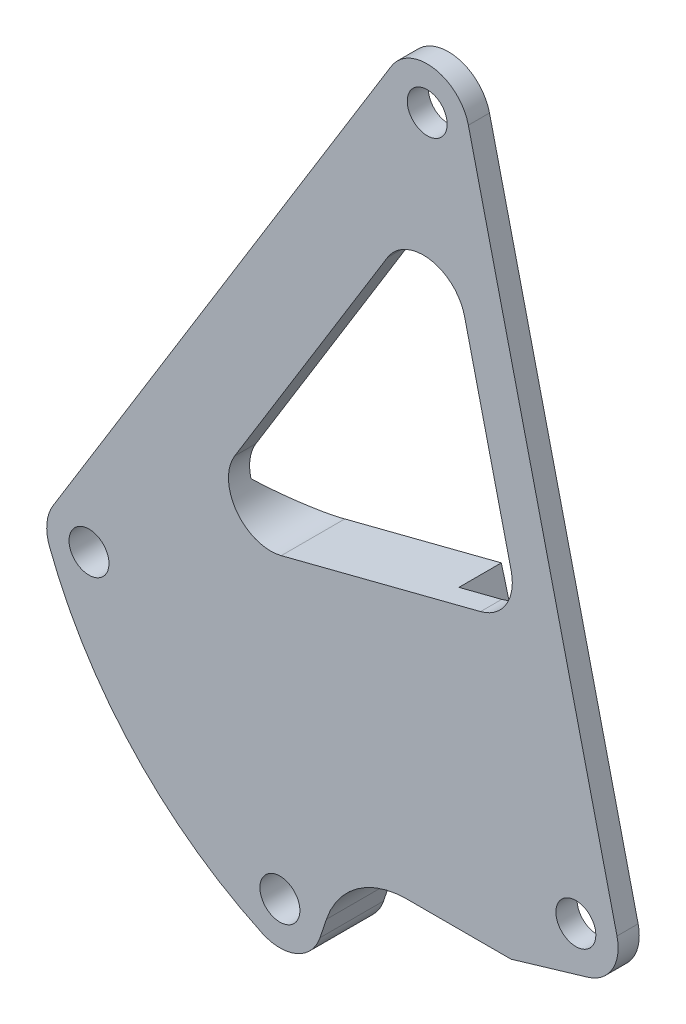
ISO-10303-21;
HEADER;
FILE_DESCRIPTION(('STEP AP214'),'2;1');
FILE_NAME('part.step','',(''),(''),'','','');
FILE_SCHEMA(('AUTOMOTIVE_DESIGN { 1 0 10303 214 1 1 1 1 }'));
ENDSEC;
DATA;
#1=APPLICATION_CONTEXT('core data for automotive mechanical design processes');
#2=APPLICATION_PROTOCOL_DEFINITION('international standard','automotive_design',2000,#1);
#3=PRODUCT_CONTEXT('',#1,'mechanical');
#4=PRODUCT('Part','Part','',(#3));
#5=PRODUCT_RELATED_PRODUCT_CATEGORY('part','',(#4));
#6=PRODUCT_DEFINITION_FORMATION('','',#4);
#7=PRODUCT_DEFINITION_CONTEXT('part definition',#1,'design');
#8=PRODUCT_DEFINITION('design','',#6,#7);
#9=PRODUCT_DEFINITION_SHAPE('','',#8);
#10=(LENGTH_UNIT() NAMED_UNIT(*) SI_UNIT(.MILLI.,.METRE.));
#11=(NAMED_UNIT(*) PLANE_ANGLE_UNIT() SI_UNIT($,.RADIAN.));
#12=(NAMED_UNIT(*) SI_UNIT($,.STERADIAN.) SOLID_ANGLE_UNIT());
#13=UNCERTAINTY_MEASURE_WITH_UNIT(LENGTH_MEASURE(1.E-05),#10,'distance_accuracy_value','');
#14=(GEOMETRIC_REPRESENTATION_CONTEXT(3) GLOBAL_UNCERTAINTY_ASSIGNED_CONTEXT((#13)) GLOBAL_UNIT_ASSIGNED_CONTEXT((#10,
#11,#12)) REPRESENTATION_CONTEXT('',''));
#15=CARTESIAN_POINT('',(0.,0.,0.));
#16=DIRECTION('',(0.,0.,1.));
#17=DIRECTION('',(1.,0.,0.));
#18=AXIS2_PLACEMENT_3D('',#15,#16,#17);
#19=CARTESIAN_POINT('',(44.45,19.05,6.361938));
#20=DIRECTION('',(0.,0.,-1.));
#21=DIRECTION('',(-1.,0.,0.));
#22=AXIS2_PLACEMENT_3D('',#19,#20,#21);
#23=CYLINDRICAL_SURFACE('',#22,6.35);
#24=DIRECTION('',(0.,0.,-1.));
#25=VECTOR('',#24,1.);
#26=CARTESIAN_POINT('',(50.6292365836746,20.5127150245273,6.361938));
#27=LINE('',#26,#25);
#28=CARTESIAN_POINT('',(50.6292365836746,20.5127150245273,6.361938));
#29=VERTEX_POINT('',#28);
#30=CARTESIAN_POINT('',(50.6292365836746,20.5127150245273,3.186938));
#31=VERTEX_POINT('',#30);
#32=EDGE_CURVE('E502',#29,#31,#27,.T.);
#33=ORIENTED_EDGE('',*,*,#32,.F.);
#34=CARTESIAN_POINT('',(44.45,19.05,6.361938));
#35=DIRECTION('',(0.,0.,1.));
#36=DIRECTION('',(1.,0.,0.));
#37=AXIS2_PLACEMENT_3D('',#34,#35,#36);
#38=CIRCLE('',#37,6.35);
#39=CARTESIAN_POINT('',(46.2552706087755,12.9620202013237,6.361938));
#40=VERTEX_POINT('',#39);
#41=EDGE_CURVE('E208',#40,#29,#38,.T.);
#42=ORIENTED_EDGE('',*,*,#41,.F.);
#43=DIRECTION('',(0.,0.,-1.));
#44=VECTOR('',#43,1.);
#45=CARTESIAN_POINT('',(46.2552706087755,12.9620202013237,6.361938));
#46=LINE('',#45,#44);
#47=CARTESIAN_POINT('',(46.2552706087755,12.9620202013237,3.186938));
#48=VERTEX_POINT('',#47);
#49=EDGE_CURVE('E202',#40,#48,#46,.T.);
#50=ORIENTED_EDGE('',*,*,#49,.T.);
#51=CARTESIAN_POINT('',(44.45,19.05,3.186938));
#52=DIRECTION('',(0.,0.,1.));
#53=DIRECTION('',(1.,0.,0.));
#54=AXIS2_PLACEMENT_3D('',#51,#52,#53);
#55=CIRCLE('',#54,6.35);
#56=EDGE_CURVE('E209',#48,#31,#55,.T.);
#57=ORIENTED_EDGE('',*,*,#56,.T.);
#58=EDGE_LOOP('',(#33,#42,#50,#57));
#59=FACE_BOUND('',#58,.T.);
#60=ADVANCED_FACE('F49',(#59),#23,.T.);
#61=CARTESIAN_POINT('',(23.7075407900682,50.8147450314328,-3.186938));
#62=DIRECTION('',(0.966234939592872,0.257662650591734,0.));
#63=DIRECTION('',(-0.257662650591734,0.966234939592873,0.));
#64=AXIS2_PLACEMENT_3D('',#61,#62,#63);
#65=PLANE('',#64);
#66=DIRECTION('',(0.,0.,-1.));
#67=VECTOR('',#66,1.);
#68=CARTESIAN_POINT('',(23.7075407900682,50.8147450314328,3.186938));
#69=LINE('',#68,#67);
#70=CARTESIAN_POINT('',(23.7075407900682,50.8147450314328,3.186938));
#71=VERTEX_POINT('',#70);
#72=CARTESIAN_POINT('',(23.7075407900682,50.8147450314328,-3.186938));
#73=VERTEX_POINT('',#72);
#74=EDGE_CURVE('E274',#71,#73,#69,.T.);
#75=ORIENTED_EDGE('',*,*,#74,.F.);
#76=DIRECTION('',(0.257662650591734,-0.966234939592872,0.));
#77=VECTOR('',#76,1.);
#78=CARTESIAN_POINT('',(31.4406388711029,21.8156272313381,3.186938));
#79=LINE('',#78,#77);
#80=CARTESIAN_POINT('',(34.7142074581717,9.53974503143276,3.186938));
#81=VERTEX_POINT('',#80);
#82=EDGE_CURVE('E513',#71,#81,#79,.T.);
#83=ORIENTED_EDGE('',*,*,#82,.T.);
#84=DIRECTION('',(0.,0.,1.));
#85=VECTOR('',#84,1.);
#86=CARTESIAN_POINT('',(34.7142074581717,9.53974503143276,-3.186938));
#87=LINE('',#86,#85);
#88=CARTESIAN_POINT('',(34.7142074581717,9.53974503143276,-3.186938));
#89=VERTEX_POINT('',#88);
#90=EDGE_CURVE('E217',#89,#81,#87,.T.);
#91=ORIENTED_EDGE('',*,*,#90,.F.);
#92=DIRECTION('',(-0.257662650591734,0.966234939592872,0.));
#93=VECTOR('',#92,1.);
#94=CARTESIAN_POINT('',(23.7075407900682,50.8147450314328,-3.186938));
#95=LINE('',#94,#93);
#96=EDGE_CURVE('E241',#89,#73,#95,.T.);
#97=ORIENTED_EDGE('',*,*,#96,.T.);
#98=EDGE_LOOP('',(#75,#83,#91,#97));
#99=FACE_BOUND('',#98,.T.);
#100=ADVANCED_FACE('F400',(#99),#65,.T.);
#101=CARTESIAN_POINT('',(-28.67279,30.80258,3.186938));
#102=DIRECTION('',(0.,0.,-1.));
#103=DIRECTION('',(-1.,0.,0.));
#104=AXIS2_PLACEMENT_3D('',#101,#102,#103);
#105=CYLINDRICAL_SURFACE('',#104,6.35);
#106=DIRECTION('',(0.,0.,-1.));
#107=VECTOR('',#106,1.);
#108=CARTESIAN_POINT('',(-34.0808203110739,34.1305986529685,6.361938));
#109=LINE('',#108,#107);
#110=CARTESIAN_POINT('',(-34.0808203110739,34.1305986529685,6.361938));
#111=VERTEX_POINT('',#110);
#112=CARTESIAN_POINT('',(-34.0808203110739,34.1305986529685,-3.16306200000008));
#113=VERTEX_POINT('',#112);
#114=EDGE_CURVE('E467',#111,#113,#109,.T.);
#115=ORIENTED_EDGE('',*,*,#114,.T.);
#116=CARTESIAN_POINT('',(-28.67279,30.80258,-3.16306200000008));
#117=DIRECTION('',(0.,0.,1.));
#118=DIRECTION('',(1.,0.,0.));
#119=AXIS2_PLACEMENT_3D('',#116,#117,#118);
#120=CIRCLE('',#119,6.35);
#121=CARTESIAN_POINT('',(-30.2527421807848,36.9528849604417,-3.16306200000008));
#122=VERTEX_POINT('',#121);
#123=EDGE_CURVE('E340',#113,#122,#120,.F.);
#124=ORIENTED_EDGE('',*,*,#123,.T.);
#125=DIRECTION('',(0.,0.,-1.));
#126=VECTOR('',#125,1.);
#127=CARTESIAN_POINT('',(-30.2527421807848,36.9528849604417,3.186938));
#128=LINE('',#127,#126);
#129=CARTESIAN_POINT('',(-30.2527421807848,36.9528849604417,-3.186938));
#130=VERTEX_POINT('',#129);
#131=EDGE_CURVE('E271',#122,#130,#128,.T.);
#132=ORIENTED_EDGE('',*,*,#131,.T.);
#133=CARTESIAN_POINT('',(-28.67279,30.80258,-3.186938));
#134=DIRECTION('',(0.,0.,1.));
#135=DIRECTION('',(1.,0.,0.));
#136=AXIS2_PLACEMENT_3D('',#133,#134,#135);
#137=CIRCLE('',#136,6.35);
#138=CARTESIAN_POINT('',(-34.6046085913835,28.5362993027083,-3.186938));
#139=VERTEX_POINT('',#138);
#140=EDGE_CURVE('E252',#130,#139,#137,.T.);
#141=ORIENTED_EDGE('',*,*,#140,.T.);
#142=DIRECTION('',(0.,0.,-1.));
#143=VECTOR('',#142,1.);
#144=CARTESIAN_POINT('',(-34.6046085913835,28.5362993027083,3.186938));
#145=LINE('',#144,#143);
#146=CARTESIAN_POINT('',(-34.6046085913835,28.5362993027083,6.361938));
#147=VERTEX_POINT('',#146);
#148=EDGE_CURVE('E285',#147,#139,#145,.T.);
#149=ORIENTED_EDGE('',*,*,#148,.F.);
#150=CARTESIAN_POINT('',(-28.67279,30.80258,6.361938));
#151=DIRECTION('',(0.,0.,1.));
#152=DIRECTION('',(1.,0.,0.));
#153=AXIS2_PLACEMENT_3D('',#150,#151,#152);
#154=CIRCLE('',#153,6.35);
#155=EDGE_CURVE('E562',#111,#147,#154,.T.);
#156=ORIENTED_EDGE('',*,*,#155,.F.);
#157=EDGE_LOOP('',(#115,#124,#132,#141,#149,#156));
#158=FACE_BOUND('',#157,.T.);
#159=ADVANCED_FACE('F397',(#158),#105,.T.);
#160=CARTESIAN_POINT('',(-30.2527421807848,36.9528849604417,3.186938));
#161=DIRECTION('',(-0.248811367052726,0.968551962274278,0.));
#162=DIRECTION('',(-0.968551962274278,-0.248811367052726,0.));
#163=AXIS2_PLACEMENT_3D('',#160,#161,#162);
#164=PLANE('',#163);
#165=ORIENTED_EDGE('',*,*,#131,.F.);
#166=DIRECTION('',(0.968551962274278,0.248811367052726,0.));
#167=VECTOR('',#166,1.);
#168=CARTESIAN_POINT('',(-30.2527421807848,36.9528849604417,-3.16306200000008));
#169=LINE('',#168,#167);
#170=CARTESIAN_POINT('',(0.203574933007444,44.776809944993,-3.16306200000008));
#171=VERTEX_POINT('',#170);
#172=EDGE_CURVE('E344',#122,#171,#169,.T.);
#173=ORIENTED_EDGE('',*,*,#172,.T.);
#174=DIRECTION('',(0.,0.,-1.));
#175=VECTOR('',#174,1.);
#176=CARTESIAN_POINT('',(0.203574933007444,44.776809944993,3.186938));
#177=LINE('',#176,#175);
#178=CARTESIAN_POINT('',(0.203574933007445,44.776809944993,6.361938));
#179=VERTEX_POINT('',#178);
#180=EDGE_CURVE('E309',#171,#179,#177,.F.);
#181=ORIENTED_EDGE('',*,*,#180,.T.);
#182=DIRECTION('',(-0.968551962274278,-0.248811367052726,0.));
#183=VECTOR('',#182,1.);
#184=CARTESIAN_POINT('',(-10.7780146245163,41.9557487973768,6.361938));
#185=LINE('',#184,#183);
#186=CARTESIAN_POINT('',(30.1383706068282,52.4667612580421,6.361938));
#187=VERTEX_POINT('',#186);
#188=EDGE_CURVE('E558',#187,#179,#185,.T.);
#189=ORIENTED_EDGE('',*,*,#188,.F.);
#190=DIRECTION('',(0.,0.,1.));
#191=VECTOR('',#190,1.);
#192=CARTESIAN_POINT('',(30.1383706068281,52.4667612580421,3.186938));
#193=LINE('',#192,#191);
#194=CARTESIAN_POINT('',(30.1383706068281,52.4667612580422,3.186938));
#195=VERTEX_POINT('',#194);
#196=EDGE_CURVE('E312',#187,#195,#193,.F.);
#197=ORIENTED_EDGE('',*,*,#196,.T.);
#198=DIRECTION('',(-0.968551962274277,-0.248811367052727,0.));
#199=VECTOR('',#198,1.);
#200=CARTESIAN_POINT('',(23.7075407900682,50.8147450314328,3.186938));
#201=LINE('',#200,#199);
#202=EDGE_CURVE('E479',#195,#71,#201,.T.);
#203=ORIENTED_EDGE('',*,*,#202,.T.);
#204=ORIENTED_EDGE('',*,*,#74,.T.);
#205=DIRECTION('',(0.968551962274278,0.248811367052726,0.));
#206=VECTOR('',#205,1.);
#207=CARTESIAN_POINT('',(-30.2527421807848,36.9528849604417,-3.186938));
#208=LINE('',#207,#206);
#209=EDGE_CURVE('E267',#130,#73,#208,.T.);
#210=ORIENTED_EDGE('',*,*,#209,.F.);
#211=EDGE_LOOP('',(#165,#173,#181,#189,#197,#203,#204,#210));
#212=FACE_BOUND('',#211,.T.);
#213=ADVANCED_FACE('F395',(#212),#164,.T.);
#214=CARTESIAN_POINT('',(0.,0.,-3.186938));
#215=DIRECTION('',(0.,0.,1.));
#216=DIRECTION('',(1.,0.,0.));
#217=AXIS2_PLACEMENT_3D('',#214,#215,#216);
#218=PLANE('',#217);
#219=CARTESIAN_POINT('',(-28.67279,30.80258,-3.186938));
#220=DIRECTION('',(0.,0.,1.));
#221=DIRECTION('',(1.,0.,0.));
#222=AXIS2_PLACEMENT_3D('',#219,#220,#221);
#223=CIRCLE('',#222,3.);
#224=CARTESIAN_POINT('',(-25.67279,30.80258,-3.186938));
#225=VERTEX_POINT('',#224);
#226=EDGE_CURVE('E248',#225,#225,#223,.T.);
#227=ORIENTED_EDGE('',*,*,#226,.T.);
#228=EDGE_LOOP('',(#227));
#229=FACE_BOUND('',#228,.T.);
#230=CARTESIAN_POINT('',(0.,0.,-3.186938));
#231=DIRECTION('',(0.,0.,1.));
#232=DIRECTION('',(1.,0.,0.));
#233=AXIS2_PLACEMENT_3D('',#230,#231,#232);
#234=CIRCLE('',#233,3.);
#235=CARTESIAN_POINT('',(3.,0.,-3.186938));
#236=VERTEX_POINT('',#235);
#237=EDGE_CURVE('E247',#236,#236,#234,.T.);
#238=ORIENTED_EDGE('',*,*,#237,.T.);
#239=EDGE_LOOP('',(#238));
#240=FACE_BOUND('',#239,.T.);
#241=CARTESIAN_POINT('',(23.7075407900682,50.8147450314328,-3.186938));
#242=DIRECTION('',(0.,0.,1.));
#243=DIRECTION('',(1.,0.,0.));
#244=AXIS2_PLACEMENT_3D('',#241,#242,#243);
#245=CIRCLE('',#244,62.423039893716);
#246=CARTESIAN_POINT('',(-2.68476409166118,-5.75452359210793,-3.186938));
#247=VERTEX_POINT('',#246);
#248=EDGE_CURVE('E259',#139,#247,#245,.T.);
#249=ORIENTED_EDGE('',*,*,#248,.F.);
#250=ORIENTED_EDGE('',*,*,#140,.F.);
#251=ORIENTED_EDGE('',*,*,#209,.T.);
#252=ORIENTED_EDGE('',*,*,#96,.F.);
#253=DIRECTION('',(1.,0.,0.));
#254=VECTOR('',#253,1.);
#255=CARTESIAN_POINT('',(23.7075407900682,9.53974503143276,-3.186938));
#256=LINE('',#255,#254);
#257=CARTESIAN_POINT('',(19.0311711474466,9.53974503143276,-3.186938));
#258=VERTEX_POINT('',#257);
#259=EDGE_CURVE('E233',#258,#89,#256,.T.);
#260=ORIENTED_EDGE('',*,*,#259,.F.);
#261=CARTESIAN_POINT('',(19.0311711474466,-3.16025496856724,-3.186938));
#262=DIRECTION('',(0.,0.,1.));
#263=DIRECTION('',(1.,0.,0.));
#264=AXIS2_PLACEMENT_3D('',#261,#262,#263);
#265=CIRCLE('',#264,12.7);
#266=CARTESIAN_POINT('',(6.98808774241796,0.871387637061967,-3.186938));
#267=VERTEX_POINT('',#266);
#268=EDGE_CURVE('E298',#258,#267,#265,.T.);
#269=ORIENTED_EDGE('',*,*,#268,.T.);
#270=DIRECTION('',(0.317452173671591,0.94827428386052,0.));
#271=VECTOR('',#270,1.);
#272=CARTESIAN_POINT('',(6.0215417025143,-2.0158213028146,-3.186938));
#273=LINE('',#272,#271);
#274=CARTESIAN_POINT('',(6.0215417025143,-2.0158213028146,-3.186938));
#275=VERTEX_POINT('',#274);
#276=EDGE_CURVE('E263',#275,#267,#273,.T.);
#277=ORIENTED_EDGE('',*,*,#276,.F.);
#278=CARTESIAN_POINT('',(0.,0.,-3.186938));
#279=DIRECTION('',(0.,0.,1.));
#280=DIRECTION('',(1.,0.,0.));
#281=AXIS2_PLACEMENT_3D('',#278,#279,#280);
#282=CIRCLE('',#281,6.35);
#283=EDGE_CURVE('E289',#247,#275,#282,.T.);
#284=ORIENTED_EDGE('',*,*,#283,.F.);
#285=EDGE_LOOP('',(#249,#250,#251,#252,#260,#269,#277,#284));
#286=FACE_BOUND('',#285,.T.);
#287=ADVANCED_FACE('F391',(#229,#240,#286),#218,.F.);
#288=CARTESIAN_POINT('',(0.,0.,3.186938));
#289=DIRECTION('',(0.,0.,-1.));
#290=DIRECTION('',(-1.,0.,0.));
#291=AXIS2_PLACEMENT_3D('',#288,#289,#290);
#292=CYLINDRICAL_SURFACE('',#291,6.35);
#293=DIRECTION('',(0.,0.,-1.));
#294=VECTOR('',#293,1.);
#295=CARTESIAN_POINT('',(6.0215417025143,-2.0158213028146,3.186938));
#296=LINE('',#295,#294);
#297=CARTESIAN_POINT('',(6.0215417025143,-2.0158213028146,6.361938));
#298=VERTEX_POINT('',#297);
#299=EDGE_CURVE('E277',#298,#275,#296,.T.);
#300=ORIENTED_EDGE('',*,*,#299,.F.);
#301=CARTESIAN_POINT('',(0.,0.,6.361938));
#302=DIRECTION('',(0.,0.,1.));
#303=DIRECTION('',(1.,0.,0.));
#304=AXIS2_PLACEMENT_3D('',#301,#302,#303);
#305=CIRCLE('',#304,6.35);
#306=CARTESIAN_POINT('',(-2.68476409166117,-5.75452359210793,6.361938));
#307=VERTEX_POINT('',#306);
#308=EDGE_CURVE('E569',#307,#298,#305,.T.);
#309=ORIENTED_EDGE('',*,*,#308,.F.);
#310=DIRECTION('',(0.,0.,-1.));
#311=VECTOR('',#310,1.);
#312=CARTESIAN_POINT('',(-2.68476409166118,-5.75452359210793,3.186938));
#313=LINE('',#312,#311);
#314=EDGE_CURVE('E281',#307,#247,#313,.T.);
#315=ORIENTED_EDGE('',*,*,#314,.T.);
#316=ORIENTED_EDGE('',*,*,#283,.T.);
#317=EDGE_LOOP('',(#300,#309,#315,#316));
#318=FACE_BOUND('',#317,.T.);
#319=ADVANCED_FACE('F387',(#318),#292,.T.);
#320=CARTESIAN_POINT('',(23.7075407900682,50.8147450314328,3.186938));
#321=DIRECTION('',(0.,0.,-1.));
#322=DIRECTION('',(-1.,0.,0.));
#323=AXIS2_PLACEMENT_3D('',#320,#321,#322);
#324=CYLINDRICAL_SURFACE('',#323,62.423039893716);
#325=ORIENTED_EDGE('',*,*,#248,.T.);
#326=ORIENTED_EDGE('',*,*,#314,.F.);
#327=CARTESIAN_POINT('',(23.7075407900682,50.8147450314328,6.361938));
#328=DIRECTION('',(0.,0.,1.));
#329=DIRECTION('',(1.,0.,0.));
#330=AXIS2_PLACEMENT_3D('',#327,#328,#329);
#331=CIRCLE('',#330,62.423039893716);
#332=EDGE_CURVE('E565',#147,#307,#331,.T.);
#333=ORIENTED_EDGE('',*,*,#332,.F.);
#334=ORIENTED_EDGE('',*,*,#148,.T.);
#335=EDGE_LOOP('',(#325,#326,#333,#334));
#336=FACE_BOUND('',#335,.T.);
#337=ADVANCED_FACE('F390',(#336),#324,.T.);
#338=CARTESIAN_POINT('',(6.0215417025143,-2.0158213028146,3.186938));
#339=DIRECTION('',(-0.94827428386052,0.317452173671591,0.));
#340=DIRECTION('',(-0.317452173671591,-0.94827428386052,0.));
#341=AXIS2_PLACEMENT_3D('',#338,#339,#340);
#342=PLANE('',#341);
#343=ORIENTED_EDGE('',*,*,#276,.T.);
#344=DIRECTION('',(0.,0.,1.));
#345=VECTOR('',#344,1.);
#346=CARTESIAN_POINT('',(6.98808774241796,0.871387637061967,3.186938));
#347=LINE('',#346,#345);
#348=CARTESIAN_POINT('',(6.98808774241796,0.871387637061964,6.361938));
#349=VERTEX_POINT('',#348);
#350=EDGE_CURVE('E292',#267,#349,#347,.T.);
#351=ORIENTED_EDGE('',*,*,#350,.T.);
#352=DIRECTION('',(0.317452173671591,0.94827428386052,0.));
#353=VECTOR('',#352,1.);
#354=CARTESIAN_POINT('',(6.0215417025143,-2.0158213028146,6.361938));
#355=LINE('',#354,#353);
#356=EDGE_CURVE('E235',#298,#349,#355,.T.);
#357=ORIENTED_EDGE('',*,*,#356,.F.);
#358=ORIENTED_EDGE('',*,*,#299,.T.);
#359=EDGE_LOOP('',(#343,#351,#357,#358));
#360=FACE_BOUND('',#359,.T.);
#361=ADVANCED_FACE('F404',(#360),#342,.F.);
#362=CARTESIAN_POINT('',(0.,0.,-3.186938));
#363=DIRECTION('',(0.,0.,1.));
#364=DIRECTION('',(1.,0.,0.));
#365=AXIS2_PLACEMENT_3D('',#362,#363,#364);
#366=CYLINDRICAL_SURFACE('',#365,3.);
#367=ORIENTED_EDGE('',*,*,#237,.F.);
#368=EDGE_LOOP('',(#367));
#369=FACE_BOUND('',#368,.T.);
#370=CARTESIAN_POINT('',(0.,0.,6.361938));
#371=DIRECTION('',(0.,0.,1.));
#372=DIRECTION('',(1.,0.,0.));
#373=AXIS2_PLACEMENT_3D('',#370,#371,#372);
#374=CIRCLE('',#373,3.);
#375=CARTESIAN_POINT('',(3.,0.,6.361938));
#376=VERTEX_POINT('',#375);
#377=EDGE_CURVE('E554',#376,#376,#374,.F.);
#378=ORIENTED_EDGE('',*,*,#377,.F.);
#379=EDGE_LOOP('',(#378));
#380=FACE_BOUND('',#379,.T.);
#381=ADVANCED_FACE('F408',(#369,#380),#366,.F.);
#382=CARTESIAN_POINT('',(-28.67279,30.80258,-3.186938));
#383=DIRECTION('',(0.,0.,1.));
#384=DIRECTION('',(1.,0.,0.));
#385=AXIS2_PLACEMENT_3D('',#382,#383,#384);
#386=CYLINDRICAL_SURFACE('',#385,3.);
#387=ORIENTED_EDGE('',*,*,#226,.F.);
#388=EDGE_LOOP('',(#387));
#389=FACE_BOUND('',#388,.T.);
#390=CARTESIAN_POINT('',(-28.67279,30.80258,6.361938));
#391=DIRECTION('',(0.,0.,1.));
#392=DIRECTION('',(1.,0.,0.));
#393=AXIS2_PLACEMENT_3D('',#390,#391,#392);
#394=CIRCLE('',#393,3.);
#395=CARTESIAN_POINT('',(-25.67279,30.80258,6.361938));
#396=VERTEX_POINT('',#395);
#397=EDGE_CURVE('E228',#396,#396,#394,.F.);
#398=ORIENTED_EDGE('',*,*,#397,.F.);
#399=EDGE_LOOP('',(#398));
#400=FACE_BOUND('',#399,.T.);
#401=ADVANCED_FACE('F415',(#389,#400),#386,.F.);
#402=CARTESIAN_POINT('',(34.7142074581717,9.53974503143276,-3.186938));
#403=DIRECTION('',(0.,-1.,0.));
#404=DIRECTION('',(1.,0.,0.));
#405=AXIS2_PLACEMENT_3D('',#402,#403,#404);
#406=PLANE('',#405);
#407=ORIENTED_EDGE('',*,*,#90,.T.);
#408=DIRECTION('',(0.,0.,-1.));
#409=VECTOR('',#408,1.);
#410=CARTESIAN_POINT('',(34.7142074581717,9.53974503143276,6.361938));
#411=LINE('',#410,#409);
#412=CARTESIAN_POINT('',(34.7142074581717,9.53974503143276,6.361938));
#413=VERTEX_POINT('',#412);
#414=EDGE_CURVE('E199',#413,#81,#411,.T.);
#415=ORIENTED_EDGE('',*,*,#414,.F.);
#416=DIRECTION('',(1.,0.,0.));
#417=VECTOR('',#416,1.);
#418=CARTESIAN_POINT('',(0.,9.53974503143276,6.361938));
#419=LINE('',#418,#417);
#420=CARTESIAN_POINT('',(19.0311711474466,9.53974503143276,6.361938));
#421=VERTEX_POINT('',#420);
#422=EDGE_CURVE('E215',#421,#413,#419,.T.);
#423=ORIENTED_EDGE('',*,*,#422,.F.);
#424=DIRECTION('',(0.,0.,1.));
#425=VECTOR('',#424,1.);
#426=CARTESIAN_POINT('',(19.0311711474466,9.53974503143276,-3.186938));
#427=LINE('',#426,#425);
#428=EDGE_CURVE('E295',#421,#258,#427,.F.);
#429=ORIENTED_EDGE('',*,*,#428,.T.);
#430=ORIENTED_EDGE('',*,*,#259,.T.);
#431=EDGE_LOOP('',(#407,#415,#423,#429,#430));
#432=FACE_BOUND('',#431,.T.);
#433=ADVANCED_FACE('F214',(#432),#406,.T.);
#434=CARTESIAN_POINT('',(19.0311711474466,-3.16025496856724,3.186938));
#435=DIRECTION('',(0.,0.,1.));
#436=DIRECTION('',(1.,0.,0.));
#437=AXIS2_PLACEMENT_3D('',#434,#435,#436);
#438=CYLINDRICAL_SURFACE('',#437,12.7);
#439=ORIENTED_EDGE('',*,*,#268,.F.);
#440=ORIENTED_EDGE('',*,*,#428,.F.);
#441=CARTESIAN_POINT('',(19.0311711474466,-3.16025496856724,6.361938));
#442=DIRECTION('',(0.,0.,1.));
#443=DIRECTION('',(1.,0.,0.));
#444=AXIS2_PLACEMENT_3D('',#441,#442,#443);
#445=CIRCLE('',#444,12.7);
#446=EDGE_CURVE('E226',#349,#421,#445,.F.);
#447=ORIENTED_EDGE('',*,*,#446,.F.);
#448=ORIENTED_EDGE('',*,*,#350,.F.);
#449=EDGE_LOOP('',(#439,#440,#447,#448));
#450=FACE_BOUND('',#449,.T.);
#451=ADVANCED_FACE('F383',(#450),#438,.F.);
#452=CARTESIAN_POINT('',(0.,0.,6.361938));
#453=DIRECTION('',(0.,0.,1.));
#454=DIRECTION('',(1.,0.,0.));
#455=AXIS2_PLACEMENT_3D('',#452,#453,#454);
#456=PLANE('',#455);
#457=DIRECTION('',(-0.2303488227602,0.973108123413318,0.));
#458=VECTOR('',#457,1.);
#459=CARTESIAN_POINT('',(24.1985104888758,104.60237538596,6.361938));
#460=LINE('',#459,#458);
#461=CARTESIAN_POINT('',(34.7376550097179,60.0797812430111,6.361938));
#462=VERTEX_POINT('',#461);
#463=CARTESIAN_POINT('',(27.736354694195,89.6567598871959,6.361938));
#464=VERTEX_POINT('',#463);
#465=EDGE_CURVE('E490',#462,#464,#460,.T.);
#466=ORIENTED_EDGE('',*,*,#465,.F.);
#467=CARTESIAN_POINT('',(28.5584184260433,58.6170662184838,6.361938));
#468=DIRECTION('',(0.,0.,1.));
#469=DIRECTION('',(1.,0.,0.));
#470=AXIS2_PLACEMENT_3D('',#467,#468,#469);
#471=CIRCLE('',#470,6.35);
#472=EDGE_CURVE('E322',#462,#187,#471,.F.);
#473=ORIENTED_EDGE('',*,*,#472,.T.);
#474=ORIENTED_EDGE('',*,*,#188,.T.);
#475=CARTESIAN_POINT('',(-1.37637724777737,50.9271149054347,6.361938));
#476=DIRECTION('',(0.,0.,1.));
#477=DIRECTION('',(1.,0.,0.));
#478=AXIS2_PLACEMENT_3D('',#475,#476,#477);
#479=CIRCLE('',#478,6.35);
#480=CARTESIAN_POINT('',(-6.78440755885122,54.2551335584032,6.361938));
#481=VERTEX_POINT('',#480);
#482=EDGE_CURVE('E331',#179,#481,#479,.F.);
#483=ORIENTED_EDGE('',*,*,#482,.T.);
#484=DIRECTION('',(0.524097425664335,0.851658316704544,0.));
#485=VECTOR('',#484,1.);
#486=CARTESIAN_POINT('',(27.5352403110739,110.024561347031,6.361938));
#487=LINE('',#486,#485);
#488=CARTESIAN_POINT('',(16.1490877994466,91.5220635156372,6.361938));
#489=VERTEX_POINT('',#488);
#490=EDGE_CURVE('E460',#481,#489,#487,.T.);
#491=ORIENTED_EDGE('',*,*,#490,.T.);
#492=CARTESIAN_POINT('',(21.5571181105204,88.1940448626686,6.361938));
#493=DIRECTION('',(0.,0.,1.));
#494=DIRECTION('',(1.,0.,0.));
#495=AXIS2_PLACEMENT_3D('',#492,#493,#494);
#496=CIRCLE('',#495,6.35);
#497=EDGE_CURVE('E337',#489,#464,#496,.F.);
#498=ORIENTED_EDGE('',*,*,#497,.T.);
#499=EDGE_LOOP('',(#466,#473,#474,#483,#491,#498));
#500=FACE_BOUND('',#499,.T.);
#501=ORIENTED_EDGE('',*,*,#41,.T.);
#502=DIRECTION('',(0.2303488227602,-0.973108123413318,0.));
#503=VECTOR('',#502,1.);
#504=CARTESIAN_POINT('',(50.6292365836746,20.5127150245273,6.361938));
#505=LINE('',#504,#503);
#506=CARTESIAN_POINT('',(28.3064465836746,114.815295024527,6.361938));
#507=VERTEX_POINT('',#506);
#508=EDGE_CURVE('E494',#507,#29,#505,.T.);
#509=ORIENTED_EDGE('',*,*,#508,.F.);
#510=CARTESIAN_POINT('',(22.12721,113.35258,6.361938));
#511=DIRECTION('',(0.,0.,1.));
#512=DIRECTION('',(1.,0.,0.));
#513=AXIS2_PLACEMENT_3D('',#510,#511,#512);
#514=CIRCLE('',#513,6.35);
#515=CARTESIAN_POINT('',(16.7191796889261,116.680598652969,6.361938));
#516=VERTEX_POINT('',#515);
#517=EDGE_CURVE('E536',#507,#516,#514,.T.);
#518=ORIENTED_EDGE('',*,*,#517,.T.);
#519=DIRECTION('',(-0.524097425664335,-0.851658316704544,0.));
#520=VECTOR('',#519,1.);
#521=CARTESIAN_POINT('',(16.7191796889261,116.680598652969,6.361938));
#522=LINE('',#521,#520);
#523=EDGE_CURVE('E468',#516,#111,#522,.T.);
#524=ORIENTED_EDGE('',*,*,#523,.T.);
#525=ORIENTED_EDGE('',*,*,#155,.T.);
#526=ORIENTED_EDGE('',*,*,#332,.T.);
#527=ORIENTED_EDGE('',*,*,#308,.T.);
#528=ORIENTED_EDGE('',*,*,#356,.T.);
#529=ORIENTED_EDGE('',*,*,#446,.T.);
#530=ORIENTED_EDGE('',*,*,#422,.T.);
#531=DIRECTION('',(0.958736976169502,0.284294584059138,0.));
#532=VECTOR('',#531,1.);
#533=CARTESIAN_POINT('',(34.7142074581717,9.53974503143276,6.361938));
#534=LINE('',#533,#532);
#535=EDGE_CURVE('E196',#413,#40,#534,.T.);
#536=ORIENTED_EDGE('',*,*,#535,.T.);
#537=EDGE_LOOP('',(#501,#509,#518,#524,#525,#526,#527,#528,#529,#530,#536));
#538=FACE_BOUND('',#537,.T.);
#539=ORIENTED_EDGE('',*,*,#377,.T.);
#540=EDGE_LOOP('',(#539));
#541=FACE_BOUND('',#540,.T.);
#542=ORIENTED_EDGE('',*,*,#397,.T.);
#543=EDGE_LOOP('',(#542));
#544=FACE_BOUND('',#543,.T.);
#545=CARTESIAN_POINT('',(22.12721,113.35258,6.361938));
#546=DIRECTION('',(0.,0.,1.));
#547=DIRECTION('',(1.,0.,0.));
#548=AXIS2_PLACEMENT_3D('',#545,#546,#547);
#549=CIRCLE('',#548,3.);
#550=CARTESIAN_POINT('',(25.12721,113.35258,6.361938));
#551=VERTEX_POINT('',#550);
#552=EDGE_CURVE('E528',#551,#551,#549,.T.);
#553=ORIENTED_EDGE('',*,*,#552,.F.);
#554=EDGE_LOOP('',(#553));
#555=FACE_BOUND('',#554,.T.);
#556=CARTESIAN_POINT('',(44.45,19.05,6.361938));
#557=DIRECTION('',(0.,0.,1.));
#558=DIRECTION('',(1.,0.,0.));
#559=AXIS2_PLACEMENT_3D('',#556,#557,#558);
#560=CIRCLE('',#559,3.);
#561=CARTESIAN_POINT('',(47.45,19.05,6.361938));
#562=VERTEX_POINT('',#561);
#563=EDGE_CURVE('E509',#562,#562,#560,.T.);
#564=ORIENTED_EDGE('',*,*,#563,.F.);
#565=EDGE_LOOP('',(#564));
#566=FACE_BOUND('',#565,.T.);
#567=ADVANCED_FACE('F222',(#500,#538,#541,#544,#555,#566),#456,.T.);
#568=CARTESIAN_POINT('',(22.12721,113.35258,3.186938));
#569=DIRECTION('',(0.,0.,1.));
#570=DIRECTION('',(1.,0.,0.));
#571=AXIS2_PLACEMENT_3D('',#568,#569,#570);
#572=PLANE('',#571);
#573=CARTESIAN_POINT('',(-1.37637724777737,50.9271149054347,3.186938));
#574=DIRECTION('',(0.,0.,1.));
#575=DIRECTION('',(1.,0.,0.));
#576=AXIS2_PLACEMENT_3D('',#573,#574,#575);
#577=CIRCLE('',#576,6.35);
#578=CARTESIAN_POINT('',(-6.78440755885122,54.2551335584032,3.186938));
#579=VERTEX_POINT('',#578);
#580=CARTESIAN_POINT('',(-7.52668220821904,49.3471627246499,3.186938));
#581=VERTEX_POINT('',#580);
#582=EDGE_CURVE('E328',#579,#581,#577,.T.);
#583=ORIENTED_EDGE('',*,*,#582,.T.);
#584=DIRECTION('',(-0.968551962274278,-0.248811367052726,0.));
#585=VECTOR('',#584,1.);
#586=CARTESIAN_POINT('',(35.7158803475808,60.4557470065996,3.186938));
#587=LINE('',#586,#585);
#588=CARTESIAN_POINT('',(-27.9445663494981,44.1020113405291,3.186938));
#589=VERTEX_POINT('',#588);
#590=EDGE_CURVE('E73',#581,#589,#587,.T.);
#591=ORIENTED_EDGE('',*,*,#590,.T.);
#592=DIRECTION('',(-0.524097425664335,-0.851658316704544,0.));
#593=VECTOR('',#592,1.);
#594=CARTESIAN_POINT('',(16.7191796889261,116.680598652969,3.186938));
#595=LINE('',#594,#593);
#596=CARTESIAN_POINT('',(16.7191796889261,116.680598652969,3.186938));
#597=VERTEX_POINT('',#596);
#598=EDGE_CURVE('E543',#597,#589,#595,.T.);
#599=ORIENTED_EDGE('',*,*,#598,.F.);
#600=CARTESIAN_POINT('',(22.12721,113.35258,3.186938));
#601=DIRECTION('',(0.,0.,1.));
#602=DIRECTION('',(1.,0.,0.));
#603=AXIS2_PLACEMENT_3D('',#600,#601,#602);
#604=CIRCLE('',#603,6.35);
#605=CARTESIAN_POINT('',(28.3064465836746,114.815295024527,3.186938));
#606=VERTEX_POINT('',#605);
#607=EDGE_CURVE('E532',#606,#597,#604,.T.);
#608=ORIENTED_EDGE('',*,*,#607,.F.);
#609=DIRECTION('',(0.2303488227602,-0.973108123413318,0.));
#610=VECTOR('',#609,1.);
#611=CARTESIAN_POINT('',(50.6292365836746,20.5127150245273,3.186938));
#612=LINE('',#611,#610);
#613=EDGE_CURVE('E487',#606,#31,#612,.T.);
#614=ORIENTED_EDGE('',*,*,#613,.T.);
#615=ORIENTED_EDGE('',*,*,#56,.F.);
#616=DIRECTION('',(0.958736976169502,0.284294584059138,0.));
#617=VECTOR('',#616,1.);
#618=CARTESIAN_POINT('',(34.7142074581717,9.53974503143276,3.186938));
#619=LINE('',#618,#617);
#620=EDGE_CURVE('E521',#81,#48,#619,.T.);
#621=ORIENTED_EDGE('',*,*,#620,.F.);
#622=ORIENTED_EDGE('',*,*,#82,.F.);
#623=ORIENTED_EDGE('',*,*,#202,.F.);
#624=CARTESIAN_POINT('',(28.5584184260433,58.6170662184838,3.186938));
#625=DIRECTION('',(0.,0.,1.));
#626=DIRECTION('',(1.,0.,0.));
#627=AXIS2_PLACEMENT_3D('',#624,#625,#626);
#628=CIRCLE('',#627,6.35);
#629=CARTESIAN_POINT('',(34.7376550097179,60.0797812430111,3.186938));
#630=VERTEX_POINT('',#629);
#631=EDGE_CURVE('E325',#195,#630,#628,.T.);
#632=ORIENTED_EDGE('',*,*,#631,.T.);
#633=DIRECTION('',(-0.2303488227602,0.973108123413318,0.));
#634=VECTOR('',#633,1.);
#635=CARTESIAN_POINT('',(24.1985104888758,104.60237538596,3.186938));
#636=LINE('',#635,#634);
#637=CARTESIAN_POINT('',(27.736354694195,89.6567598871959,3.186938));
#638=VERTEX_POINT('',#637);
#639=EDGE_CURVE('E481',#630,#638,#636,.T.);
#640=ORIENTED_EDGE('',*,*,#639,.T.);
#641=CARTESIAN_POINT('',(21.5571181105204,88.1940448626686,3.186938));
#642=DIRECTION('',(0.,0.,1.));
#643=DIRECTION('',(1.,0.,0.));
#644=AXIS2_PLACEMENT_3D('',#641,#642,#643);
#645=CIRCLE('',#644,6.35);
#646=CARTESIAN_POINT('',(16.1490877994466,91.5220635156372,3.186938));
#647=VERTEX_POINT('',#646);
#648=EDGE_CURVE('E334',#638,#647,#645,.T.);
#649=ORIENTED_EDGE('',*,*,#648,.T.);
#650=DIRECTION('',(0.524097425664335,0.851658316704544,0.));
#651=VECTOR('',#650,1.);
#652=CARTESIAN_POINT('',(27.5352403110739,110.024561347031,3.186938));
#653=LINE('',#652,#651);
#654=EDGE_CURVE('E473',#579,#647,#653,.T.);
#655=ORIENTED_EDGE('',*,*,#654,.F.);
#656=EDGE_LOOP('',(#583,#591,#599,#608,#614,#615,#621,#622,#623,#632,#640,#649,#655));
#657=FACE_BOUND('',#656,.T.);
#658=CARTESIAN_POINT('',(22.12721,113.35258,3.186938));
#659=DIRECTION('',(0.,0.,1.));
#660=DIRECTION('',(1.,0.,0.));
#661=AXIS2_PLACEMENT_3D('',#658,#659,#660);
#662=CIRCLE('',#661,3.);
#663=CARTESIAN_POINT('',(25.12721,113.35258,3.186938));
#664=VERTEX_POINT('',#663);
#665=EDGE_CURVE('E219',#664,#664,#662,.T.);
#666=ORIENTED_EDGE('',*,*,#665,.T.);
#667=EDGE_LOOP('',(#666));
#668=FACE_BOUND('',#667,.T.);
#669=CARTESIAN_POINT('',(44.45,19.05,3.186938));
#670=DIRECTION('',(0.,0.,1.));
#671=DIRECTION('',(1.,0.,0.));
#672=AXIS2_PLACEMENT_3D('',#669,#670,#671);
#673=CIRCLE('',#672,3.);
#674=CARTESIAN_POINT('',(47.45,19.05,3.186938));
#675=VERTEX_POINT('',#674);
#676=EDGE_CURVE('E506',#675,#675,#673,.T.);
#677=ORIENTED_EDGE('',*,*,#676,.T.);
#678=EDGE_LOOP('',(#677));
#679=FACE_BOUND('',#678,.T.);
#680=ADVANCED_FACE('F426',(#657,#668,#679),#572,.F.);
#681=CARTESIAN_POINT('',(22.12721,113.35258,6.361938));
#682=DIRECTION('',(0.,0.,-1.));
#683=DIRECTION('',(-1.,0.,0.));
#684=AXIS2_PLACEMENT_3D('',#681,#682,#683);
#685=CYLINDRICAL_SURFACE('',#684,6.35);
#686=ORIENTED_EDGE('',*,*,#517,.F.);
#687=DIRECTION('',(0.,0.,-1.));
#688=VECTOR('',#687,1.);
#689=CARTESIAN_POINT('',(28.3064465836746,114.815295024527,6.361938));
#690=LINE('',#689,#688);
#691=EDGE_CURVE('E497',#507,#606,#690,.T.);
#692=ORIENTED_EDGE('',*,*,#691,.T.);
#693=ORIENTED_EDGE('',*,*,#607,.T.);
#694=DIRECTION('',(0.,0.,-1.));
#695=VECTOR('',#694,1.);
#696=CARTESIAN_POINT('',(16.7191796889261,116.680598652969,6.361938));
#697=LINE('',#696,#695);
#698=EDGE_CURVE('E550',#516,#597,#697,.T.);
#699=ORIENTED_EDGE('',*,*,#698,.F.);
#700=EDGE_LOOP('',(#686,#692,#693,#699));
#701=FACE_BOUND('',#700,.T.);
#702=ADVANCED_FACE('F428',(#701),#685,.T.);
#703=CARTESIAN_POINT('',(16.7191796889261,116.680598652969,6.361938));
#704=DIRECTION('',(0.851658316704544,-0.524097425664335,0.));
#705=DIRECTION('',(0.524097425664335,0.851658316704544,0.));
#706=AXIS2_PLACEMENT_3D('',#703,#704,#705);
#707=PLANE('',#706);
#708=ORIENTED_EDGE('',*,*,#598,.T.);
#709=DIRECTION('',(-0.430471936446104,-0.699516896724919,-0.570412151981951));
#710=VECTOR('',#709,1.);
#711=CARTESIAN_POINT('',(2.96654550243504,94.3325680999205,44.1468063184392));
#712=LINE('',#711,#710);
#713=CARTESIAN_POINT('',(-30.8686384541087,39.3503941705369,-0.68770775626328));
#714=VERTEX_POINT('',#713);
#715=EDGE_CURVE('E11',#589,#714,#712,.T.);
#716=ORIENTED_EDGE('',*,*,#715,.T.);
#717=CARTESIAN_POINT('',(-30.8686384541087,39.3503941705369,-0.68770775626328));
#718=CARTESIAN_POINT('',(-30.9651365200325,39.1935848134107,-0.815525446255014));
#719=CARTESIAN_POINT('',(-31.0623563564455,39.0356025792396,-0.94141428030069));
#720=CARTESIAN_POINT('',(-31.2585542615904,38.7167809833791,-1.18835676580378));
#721=CARTESIAN_POINT('',(-31.3575334120331,38.5559398639098,-1.30940728260518));
#722=CARTESIAN_POINT('',(-31.5588165760478,38.2288547223859,-1.54715328493063));
#723=CARTESIAN_POINT('',(-31.6611475932332,38.0625668194596,-1.66376600277646));
#724=CARTESIAN_POINT('',(-31.8680923076744,37.7262816584926,-1.88932763464581));
#725=CARTESIAN_POINT('',(-31.9727055704353,37.5562851065062,-1.99827799103621));
#726=CARTESIAN_POINT('',(-32.1778613597242,37.2229069489117,-2.20007316855727));
#727=CARTESIAN_POINT('',(-32.2782456454035,37.0597824846829,-2.29350008017284));
#728=CARTESIAN_POINT('',(-32.4815222293517,36.7294580357671,-2.47001546378522));
#729=CARTESIAN_POINT('',(-32.5844149299212,36.5622573973417,-2.55310226421162));
#730=CARTESIAN_POINT('',(-32.7922501629419,36.2245251436829,-2.70614085081657));
#731=CARTESIAN_POINT('',(-32.897178942155,36.0540158774617,-2.77615991426555));
#732=CARTESIAN_POINT('',(-33.109473544381,35.7090371488444,-2.90092040121842));
#733=CARTESIAN_POINT('',(-33.2168379566876,35.5345699788461,-2.95567043590638));
#734=CARTESIAN_POINT('',(-33.4311132787263,35.1863725805333,-3.04618473273483));
#735=CARTESIAN_POINT('',(-33.537975153445,35.0127220341154,-3.08236635214249));
#736=CARTESIAN_POINT('',(-33.7530971263024,34.6631488282222,-3.13558875002146));
#737=CARTESIAN_POINT('',(-33.861357890711,34.4872250860582,-3.15262003996793));
#738=CARTESIAN_POINT('',(-34.025565643455,34.2203874878492,-3.16308296782903));
#739=CARTESIAN_POINT('',(-34.0814062364593,34.1296465242172,-3.16395598797238));
#740=CARTESIAN_POINT('',(-34.1930471281521,33.9482300752165,-3.16034400137222));
#741=CARTESIAN_POINT('',(-34.2488474246888,33.8575545933443,-3.15585872702687));
#742=CARTESIAN_POINT('',(-34.3603096310805,33.6764285079577,-3.14159246471535));
#743=CARTESIAN_POINT('',(-34.4159713706364,33.5859781811794,-3.13180670200525));
#744=CARTESIAN_POINT('',(-34.5269776252929,33.4055930173625,-3.10712084077175));
#745=CARTESIAN_POINT('',(-34.5823221707613,33.3156581309765,-3.09222124044423));
#746=CARTESIAN_POINT('',(-34.6374494417657,33.2260763155943,-3.07485598838909));
#747=B_SPLINE_CURVE_WITH_KNOTS('',3,(#717,#718,#719,#720,#721,#722,#723,#724,#725,#726,#727,
#728,#729,#730,#731,#732,#733,#734,#735,#736,#737,#738,#739,#740,#741,#742,#743,#744,#745,#746),
.UNSPECIFIED.,.F.,.F.,(4,2,2,2,2,2,2,2,2,2,2,2,2,2,4),(0.,0.672452173150833,1.34533317793086,
2.02746628644046,2.70947064425586,3.34854714063417,3.98772681554559,4.62351906751836,
5.25895202703577,5.87939703537878,6.50014932393319,6.81968442553001,7.1392354858901,
7.4590748815947,7.77888312702088),.UNSPECIFIED.);
#748=EDGE_CURVE('E350',#714,#113,#747,.T.);
#749=ORIENTED_EDGE('',*,*,#748,.T.);
#750=ORIENTED_EDGE('',*,*,#114,.F.);
#751=ORIENTED_EDGE('',*,*,#523,.F.);
#752=ORIENTED_EDGE('',*,*,#698,.T.);
#753=EDGE_LOOP('',(#708,#716,#749,#750,#751,#752));
#754=FACE_BOUND('',#753,.T.);
#755=ADVANCED_FACE('F358',(#754),#707,.F.);
#756=CARTESIAN_POINT('',(27.5352403110739,110.024561347031,6.361938));
#757=DIRECTION('',(-0.851658316704544,0.524097425664335,0.));
#758=DIRECTION('',(-0.524097425664335,-0.851658316704544,0.));
#759=AXIS2_PLACEMENT_3D('',#756,#757,#758);
#760=PLANE('',#759);
#761=ORIENTED_EDGE('',*,*,#490,.F.);
#762=DIRECTION('',(0.,0.,-1.));
#763=VECTOR('',#762,1.);
#764=CARTESIAN_POINT('',(-6.78440755885123,54.2551335584032,6.361938));
#765=LINE('',#764,#763);
#766=EDGE_CURVE('E318',#481,#579,#765,.T.);
#767=ORIENTED_EDGE('',*,*,#766,.T.);
#768=ORIENTED_EDGE('',*,*,#654,.T.);
#769=DIRECTION('',(0.,0.,-1.));
#770=VECTOR('',#769,1.);
#771=CARTESIAN_POINT('',(16.1490877994466,91.5220635156372,6.361938));
#772=LINE('',#771,#770);
#773=EDGE_CURVE('E315',#647,#489,#772,.F.);
#774=ORIENTED_EDGE('',*,*,#773,.T.);
#775=EDGE_LOOP('',(#761,#767,#768,#774));
#776=FACE_BOUND('',#775,.T.);
#777=ADVANCED_FACE('F436',(#776),#760,.F.);
#778=CARTESIAN_POINT('',(22.12721,113.35258,6.361938));
#779=DIRECTION('',(0.,0.,-1.));
#780=DIRECTION('',(-1.,0.,0.));
#781=AXIS2_PLACEMENT_3D('',#778,#779,#780);
#782=CYLINDRICAL_SURFACE('',#781,3.);
#783=ORIENTED_EDGE('',*,*,#552,.T.);
#784=EDGE_LOOP('',(#783));
#785=FACE_BOUND('',#784,.T.);
#786=ORIENTED_EDGE('',*,*,#665,.F.);
#787=EDGE_LOOP('',(#786));
#788=FACE_BOUND('',#787,.T.);
#789=ADVANCED_FACE('F450',(#785,#788),#782,.F.);
#790=CARTESIAN_POINT('',(34.7142074581717,9.53974503143276,6.361938));
#791=DIRECTION('',(-0.284294584059139,0.958736976169503,0.));
#792=DIRECTION('',(-0.958736976169503,-0.284294584059139,0.));
#793=AXIS2_PLACEMENT_3D('',#790,#791,#792);
#794=PLANE('',#793);
#795=ORIENTED_EDGE('',*,*,#620,.T.);
#796=ORIENTED_EDGE('',*,*,#49,.F.);
#797=ORIENTED_EDGE('',*,*,#535,.F.);
#798=ORIENTED_EDGE('',*,*,#414,.T.);
#799=EDGE_LOOP('',(#795,#796,#797,#798));
#800=FACE_BOUND('',#799,.T.);
#801=ADVANCED_FACE('F198',(#800),#794,.F.);
#802=CARTESIAN_POINT('',(44.45,19.05,6.361938));
#803=DIRECTION('',(0.,0.,-1.));
#804=DIRECTION('',(-1.,0.,0.));
#805=AXIS2_PLACEMENT_3D('',#802,#803,#804);
#806=CYLINDRICAL_SURFACE('',#805,3.);
#807=ORIENTED_EDGE('',*,*,#563,.T.);
#808=EDGE_LOOP('',(#807));
#809=FACE_BOUND('',#808,.T.);
#810=ORIENTED_EDGE('',*,*,#676,.F.);
#811=EDGE_LOOP('',(#810));
#812=FACE_BOUND('',#811,.T.);
#813=ADVANCED_FACE('F446',(#809,#812),#806,.F.);
#814=CARTESIAN_POINT('',(50.6292365836746,20.5127150245273,6.361938));
#815=DIRECTION('',(0.973108123413318,0.2303488227602,0.));
#816=DIRECTION('',(-0.2303488227602,0.973108123413318,0.));
#817=AXIS2_PLACEMENT_3D('',#814,#815,#816);
#818=PLANE('',#817);
#819=ORIENTED_EDGE('',*,*,#613,.F.);
#820=ORIENTED_EDGE('',*,*,#691,.F.);
#821=ORIENTED_EDGE('',*,*,#508,.T.);
#822=ORIENTED_EDGE('',*,*,#32,.T.);
#823=EDGE_LOOP('',(#819,#820,#821,#822));
#824=FACE_BOUND('',#823,.T.);
#825=ADVANCED_FACE('F590',(#824),#818,.T.);
#826=CARTESIAN_POINT('',(24.1985104888758,104.60237538596,6.361938));
#827=DIRECTION('',(-0.973108123413318,-0.2303488227602,0.));
#828=DIRECTION('',(0.2303488227602,-0.973108123413318,0.));
#829=AXIS2_PLACEMENT_3D('',#826,#827,#828);
#830=PLANE('',#829);
#831=ORIENTED_EDGE('',*,*,#639,.F.);
#832=DIRECTION('',(0.,0.,1.));
#833=VECTOR('',#832,1.);
#834=CARTESIAN_POINT('',(34.7376550097179,60.0797812430111,6.361938));
#835=LINE('',#834,#833);
#836=EDGE_CURVE('E305',#630,#462,#835,.T.);
#837=ORIENTED_EDGE('',*,*,#836,.T.);
#838=ORIENTED_EDGE('',*,*,#465,.T.);
#839=DIRECTION('',(0.,0.,-1.));
#840=VECTOR('',#839,1.);
#841=CARTESIAN_POINT('',(27.736354694195,89.6567598871959,6.361938));
#842=LINE('',#841,#840);
#843=EDGE_CURVE('E301',#464,#638,#842,.T.);
#844=ORIENTED_EDGE('',*,*,#843,.T.);
#845=EDGE_LOOP('',(#831,#837,#838,#844));
#846=FACE_BOUND('',#845,.T.);
#847=ADVANCED_FACE('F381',(#846),#830,.T.);
#848=CARTESIAN_POINT('',(28.5584184260433,58.6170662184838,6.361938));
#849=DIRECTION('',(0.,0.,-1.));
#850=DIRECTION('',(-1.,0.,0.));
#851=AXIS2_PLACEMENT_3D('',#848,#849,#850);
#852=CYLINDRICAL_SURFACE('',#851,6.35);
#853=ORIENTED_EDGE('',*,*,#631,.F.);
#854=ORIENTED_EDGE('',*,*,#196,.F.);
#855=ORIENTED_EDGE('',*,*,#472,.F.);
#856=ORIENTED_EDGE('',*,*,#836,.F.);
#857=EDGE_LOOP('',(#853,#854,#855,#856));
#858=FACE_BOUND('',#857,.T.);
#859=ADVANCED_FACE('F377',(#858),#852,.F.);
#860=CARTESIAN_POINT('',(-1.37637724777737,50.9271149054347,6.361938));
#861=DIRECTION('',(0.,0.,-1.));
#862=DIRECTION('',(-1.,0.,0.));
#863=AXIS2_PLACEMENT_3D('',#860,#861,#862);
#864=CYLINDRICAL_SURFACE('',#863,6.35);
#865=ORIENTED_EDGE('',*,*,#482,.F.);
#866=ORIENTED_EDGE('',*,*,#180,.F.);
#867=CARTESIAN_POINT('',(-1.37637724777737,50.9271149054347,3.186938));
#868=DIRECTION('',(0.175936204879279,-0.684869660455683,0.707106781186543));
#869=DIRECTION('',(0.175936204879277,-0.684869660455675,-0.707106781186552));
#870=AXIS2_PLACEMENT_3D('',#867,#868,#869);
#871=ELLIPSE('',#870,8.98025612106921,6.35);
#872=EDGE_CURVE('E60',#171,#581,#871,.F.);
#873=ORIENTED_EDGE('',*,*,#872,.T.);
#874=ORIENTED_EDGE('',*,*,#582,.F.);
#875=ORIENTED_EDGE('',*,*,#766,.F.);
#876=EDGE_LOOP('',(#865,#866,#873,#874,#875));
#877=FACE_BOUND('',#876,.T.);
#878=ADVANCED_FACE('F373',(#877),#864,.F.);
#879=CARTESIAN_POINT('',(21.5571181105204,88.1940448626686,6.361938));
#880=DIRECTION('',(0.,0.,-1.));
#881=DIRECTION('',(-1.,0.,0.));
#882=AXIS2_PLACEMENT_3D('',#879,#880,#881);
#883=CYLINDRICAL_SURFACE('',#882,6.35);
#884=ORIENTED_EDGE('',*,*,#497,.F.);
#885=ORIENTED_EDGE('',*,*,#773,.F.);
#886=ORIENTED_EDGE('',*,*,#648,.F.);
#887=ORIENTED_EDGE('',*,*,#843,.F.);
#888=EDGE_LOOP('',(#884,#885,#886,#887));
#889=FACE_BOUND('',#888,.T.);
#890=ADVANCED_FACE('F370',(#889),#883,.F.);
#891=CARTESIAN_POINT('',(-30.2527421807848,36.9528849604417,-3.16306200000008));
#892=DIRECTION('',(0.175936204879279,-0.684869660455683,0.707106781186543));
#893=DIRECTION('',(0.968551962274278,0.248811367052726,0.));
#894=AXIS2_PLACEMENT_3D('',#891,#892,#893);
#895=PLANE('',#894);
#896=ORIENTED_EDGE('',*,*,#872,.F.);
#897=ORIENTED_EDGE('',*,*,#172,.F.);
#898=DIRECTION('',(0.175936204879277,-0.684869660455675,-0.707106781186551));
#899=VECTOR('',#898,1.);
#900=CARTESIAN_POINT('',(-31.8326943615696,43.1031899208833,3.186938));
#901=LINE('',#900,#899);
#902=EDGE_CURVE('E54',#714,#122,#901,.T.);
#903=ORIENTED_EDGE('',*,*,#902,.F.);
#904=ORIENTED_EDGE('',*,*,#715,.F.);
#905=ORIENTED_EDGE('',*,*,#590,.F.);
#906=EDGE_LOOP('',(#896,#897,#903,#904,#905));
#907=FACE_BOUND('',#906,.T.);
#908=ADVANCED_FACE('F52',(#907),#895,.F.);
#909=CARTESIAN_POINT('',(-28.67279,30.80258,-3.16306200000008));
#910=DIRECTION('',(0.,0.,1.));
#911=DIRECTION('',(1.,0.,0.));
#912=AXIS2_PLACEMENT_3D('',#909,#910,#911);
#913=CONICAL_SURFACE('',#912,6.35,0.785398163397442);
#914=ORIENTED_EDGE('',*,*,#123,.F.);
#915=ORIENTED_EDGE('',*,*,#748,.F.);
#916=ORIENTED_EDGE('',*,*,#902,.T.);
#917=EDGE_LOOP('',(#914,#915,#916));
#918=FACE_BOUND('',#917,.T.);
#919=ADVANCED_FACE('F363',(#918),#913,.T.);
#920=CLOSED_SHELL('',(#60,#100,#159,#213,#287,#319,#337,#361,#381,#401,#433,#451,#567,#680,#702,
#755,#777,#789,#801,#813,#825,#847,#859,#878,#890,#908,#919));
#921=MANIFOLD_SOLID_BREP('B2',#920);
#922=ADVANCED_BREP_SHAPE_REPRESENTATION('',(#18,#921),#14);
#923=SHAPE_DEFINITION_REPRESENTATION(#9,#922);
ENDSEC;
END-ISO-10303-21;
